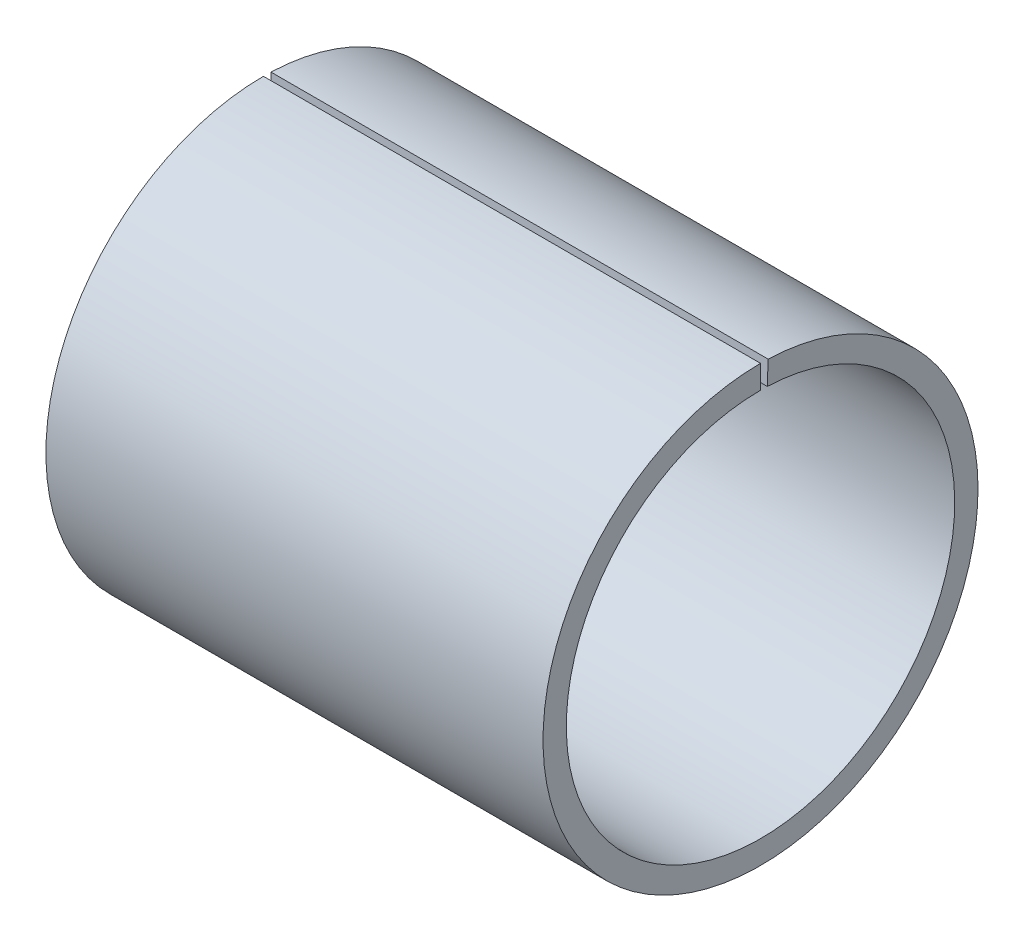
ISO-10303-21;
HEADER;
FILE_DESCRIPTION(('STEP AP214'),'2;1');
FILE_NAME('part.step','',(''),(''),'','','');
FILE_SCHEMA(('AUTOMOTIVE_DESIGN { 1 0 10303 214 1 1 1 1 }'));
ENDSEC;
DATA;
#1=APPLICATION_CONTEXT('core data for automotive mechanical design processes');
#2=APPLICATION_PROTOCOL_DEFINITION('international standard','automotive_design',2000,#1);
#3=PRODUCT_CONTEXT('',#1,'mechanical');
#4=PRODUCT('Part','Part','',(#3));
#5=PRODUCT_RELATED_PRODUCT_CATEGORY('part','',(#4));
#6=PRODUCT_DEFINITION_FORMATION('','',#4);
#7=PRODUCT_DEFINITION_CONTEXT('part definition',#1,'design');
#8=PRODUCT_DEFINITION('design','',#6,#7);
#9=PRODUCT_DEFINITION_SHAPE('','',#8);
#10=(LENGTH_UNIT() NAMED_UNIT(*) SI_UNIT(.MILLI.,.METRE.));
#11=(NAMED_UNIT(*) PLANE_ANGLE_UNIT() SI_UNIT($,.RADIAN.));
#12=(NAMED_UNIT(*) SI_UNIT($,.STERADIAN.) SOLID_ANGLE_UNIT());
#13=UNCERTAINTY_MEASURE_WITH_UNIT(LENGTH_MEASURE(1.E-05),#10,'distance_accuracy_value','');
#14=(GEOMETRIC_REPRESENTATION_CONTEXT(3) GLOBAL_UNCERTAINTY_ASSIGNED_CONTEXT((#13)) GLOBAL_UNIT_ASSIGNED_CONTEXT((#10,
#11,#12)) REPRESENTATION_CONTEXT('',''));
#15=CARTESIAN_POINT('',(0.,0.,0.));
#16=DIRECTION('',(0.,0.,1.));
#17=DIRECTION('',(1.,0.,0.));
#18=AXIS2_PLACEMENT_3D('',#15,#16,#17);
#19=CARTESIAN_POINT('',(0.,13.9914715782673,-0.488592953834825));
#20=DIRECTION('',(1.,0.,0.));
#21=DIRECTION('',(0.,0.,-1.));
#22=AXIS2_PLACEMENT_3D('',#19,#20,#21);
#23=PLANE('',#22);
#24=CARTESIAN_POINT('',(0.,0.,0.));
#25=DIRECTION('',(-1.,0.,0.));
#26=DIRECTION('',(0.,0.,1.));
#27=AXIS2_PLACEMENT_3D('',#24,#25,#26);
#28=CIRCLE('',#27,12.5);
#29=CARTESIAN_POINT('',(0.,12.4923853377387,-0.436243708781094));
#30=VERTEX_POINT('',#29);
#31=CARTESIAN_POINT('',(0.,12.5,0.));
#32=VERTEX_POINT('',#31);
#33=EDGE_CURVE('E11',#30,#32,#28,.T.);
#34=ORIENTED_EDGE('',*,*,#33,.F.);
#35=DIRECTION('',(0.,-0.999390827019096,0.0348994967024875));
#36=VECTOR('',#35,1.);
#37=CARTESIAN_POINT('',(0.,13.9914715782673,-0.488592953834825));
#38=LINE('',#37,#36);
#39=CARTESIAN_POINT('',(0.,13.9914715782673,-0.488592953834825));
#40=VERTEX_POINT('',#39);
#41=EDGE_CURVE('E95',#40,#30,#38,.T.);
#42=ORIENTED_EDGE('',*,*,#41,.F.);
#43=CARTESIAN_POINT('',(0.,0.,0.));
#44=DIRECTION('',(-1.,0.,0.));
#45=DIRECTION('',(0.,0.,1.));
#46=AXIS2_PLACEMENT_3D('',#43,#44,#45);
#47=CIRCLE('',#46,14.);
#48=CARTESIAN_POINT('',(0.,14.,0.));
#49=VERTEX_POINT('',#48);
#50=EDGE_CURVE('E48',#40,#49,#47,.T.);
#51=ORIENTED_EDGE('',*,*,#50,.T.);
#52=DIRECTION('',(0.,-1.,0.));
#53=VECTOR('',#52,1.);
#54=CARTESIAN_POINT('',(0.,14.,0.));
#55=LINE('',#54,#53);
#56=EDGE_CURVE('E84',#49,#32,#55,.T.);
#57=ORIENTED_EDGE('',*,*,#56,.T.);
#58=EDGE_LOOP('',(#34,#42,#51,#57));
#59=FACE_BOUND('',#58,.T.);
#60=ADVANCED_FACE('F33',(#59),#23,.F.);
#61=CARTESIAN_POINT('',(0.,0.,0.));
#62=DIRECTION('',(-1.,0.,0.));
#63=DIRECTION('',(0.,0.,1.));
#64=AXIS2_PLACEMENT_3D('',#61,#62,#63);
#65=CYLINDRICAL_SURFACE('',#64,12.5);
#66=CARTESIAN_POINT('',(32.,0.,0.));
#67=DIRECTION('',(-1.,0.,0.));
#68=DIRECTION('',(0.,0.,1.));
#69=AXIS2_PLACEMENT_3D('',#66,#67,#68);
#70=CIRCLE('',#69,12.5);
#71=CARTESIAN_POINT('',(32.,12.4923853377387,-0.436243708781094));
#72=VERTEX_POINT('',#71);
#73=CARTESIAN_POINT('',(32.,12.5,0.));
#74=VERTEX_POINT('',#73);
#75=EDGE_CURVE('E41',#72,#74,#70,.T.);
#76=ORIENTED_EDGE('',*,*,#75,.F.);
#77=DIRECTION('',(1.,0.,0.));
#78=VECTOR('',#77,1.);
#79=CARTESIAN_POINT('',(0.,12.4923853377387,-0.436243708781094));
#80=LINE('',#79,#78);
#81=EDGE_CURVE('E80',#30,#72,#80,.T.);
#82=ORIENTED_EDGE('',*,*,#81,.F.);
#83=ORIENTED_EDGE('',*,*,#33,.T.);
#84=DIRECTION('',(1.,0.,0.));
#85=VECTOR('',#84,1.);
#86=CARTESIAN_POINT('',(0.,12.5,0.));
#87=LINE('',#86,#85);
#88=EDGE_CURVE('E77',#32,#74,#87,.T.);
#89=ORIENTED_EDGE('',*,*,#88,.T.);
#90=EDGE_LOOP('',(#76,#82,#83,#89));
#91=FACE_BOUND('',#90,.T.);
#92=ADVANCED_FACE('F35',(#91),#65,.F.);
#93=CARTESIAN_POINT('',(32.,13.9914715782673,-0.488592953834825));
#94=DIRECTION('',(-1.,0.,0.));
#95=DIRECTION('',(0.,0.,1.));
#96=AXIS2_PLACEMENT_3D('',#93,#94,#95);
#97=PLANE('',#96);
#98=CARTESIAN_POINT('',(32.,0.,0.));
#99=DIRECTION('',(-1.,0.,0.));
#100=DIRECTION('',(0.,0.,1.));
#101=AXIS2_PLACEMENT_3D('',#98,#99,#100);
#102=CIRCLE('',#101,14.);
#103=CARTESIAN_POINT('',(32.,13.9914715782673,-0.488592953834825));
#104=VERTEX_POINT('',#103);
#105=CARTESIAN_POINT('',(32.,14.,0.));
#106=VERTEX_POINT('',#105);
#107=EDGE_CURVE('E56',#104,#106,#102,.T.);
#108=ORIENTED_EDGE('',*,*,#107,.F.);
#109=DIRECTION('',(0.,0.999390827019096,-0.0348994967024875));
#110=VECTOR('',#109,1.);
#111=CARTESIAN_POINT('',(32.,13.9914715782673,-0.488592953834825));
#112=LINE('',#111,#110);
#113=EDGE_CURVE('E98',#72,#104,#112,.T.);
#114=ORIENTED_EDGE('',*,*,#113,.F.);
#115=ORIENTED_EDGE('',*,*,#75,.T.);
#116=DIRECTION('',(0.,1.,0.));
#117=VECTOR('',#116,1.);
#118=CARTESIAN_POINT('',(32.,14.,0.));
#119=LINE('',#118,#117);
#120=EDGE_CURVE('E89',#74,#106,#119,.T.);
#121=ORIENTED_EDGE('',*,*,#120,.T.);
#122=EDGE_LOOP('',(#108,#114,#115,#121));
#123=FACE_BOUND('',#122,.T.);
#124=ADVANCED_FACE('F104',(#123),#97,.F.);
#125=CARTESIAN_POINT('',(0.,0.,0.));
#126=DIRECTION('',(-1.,0.,0.));
#127=DIRECTION('',(0.,0.,1.));
#128=AXIS2_PLACEMENT_3D('',#125,#126,#127);
#129=CYLINDRICAL_SURFACE('',#128,14.);
#130=DIRECTION('',(-1.,0.,0.));
#131=VECTOR('',#130,1.);
#132=CARTESIAN_POINT('',(0.,13.9914715782673,-0.488592953834825));
#133=LINE('',#132,#131);
#134=EDGE_CURVE('E100',#104,#40,#133,.T.);
#135=ORIENTED_EDGE('',*,*,#134,.F.);
#136=ORIENTED_EDGE('',*,*,#107,.T.);
#137=DIRECTION('',(-1.,0.,0.));
#138=VECTOR('',#137,1.);
#139=CARTESIAN_POINT('',(0.,14.,0.));
#140=LINE('',#139,#138);
#141=EDGE_CURVE('E91',#106,#49,#140,.T.);
#142=ORIENTED_EDGE('',*,*,#141,.T.);
#143=ORIENTED_EDGE('',*,*,#50,.F.);
#144=EDGE_LOOP('',(#135,#136,#142,#143));
#145=FACE_BOUND('',#144,.T.);
#146=ADVANCED_FACE('F107',(#145),#129,.T.);
#147=CARTESIAN_POINT('',(0.,12.4923853377387,-0.436243708781094));
#148=DIRECTION('',(0.,0.0348994967024875,0.999390827019096));
#149=DIRECTION('',(1.,0.,0.));
#150=AXIS2_PLACEMENT_3D('',#147,#148,#149);
#151=PLANE('',#150);
#152=ORIENTED_EDGE('',*,*,#41,.T.);
#153=ORIENTED_EDGE('',*,*,#81,.T.);
#154=ORIENTED_EDGE('',*,*,#113,.T.);
#155=ORIENTED_EDGE('',*,*,#134,.T.);
#156=EDGE_LOOP('',(#152,#153,#154,#155));
#157=FACE_BOUND('',#156,.T.);
#158=ADVANCED_FACE('F106',(#157),#151,.T.);
#159=CARTESIAN_POINT('',(0.,12.5,0.));
#160=DIRECTION('',(0.,0.,1.));
#161=DIRECTION('',(1.,0.,0.));
#162=AXIS2_PLACEMENT_3D('',#159,#160,#161);
#163=PLANE('',#162);
#164=ORIENTED_EDGE('',*,*,#56,.F.);
#165=ORIENTED_EDGE('',*,*,#141,.F.);
#166=ORIENTED_EDGE('',*,*,#120,.F.);
#167=ORIENTED_EDGE('',*,*,#88,.F.);
#168=EDGE_LOOP('',(#164,#165,#166,#167));
#169=FACE_BOUND('',#168,.T.);
#170=ADVANCED_FACE('F88',(#169),#163,.F.);
#171=CLOSED_SHELL('',(#60,#92,#124,#146,#158,#170));
#172=MANIFOLD_SOLID_BREP('B2',#171);
#173=ADVANCED_BREP_SHAPE_REPRESENTATION('',(#18,#172),#14);
#174=SHAPE_DEFINITION_REPRESENTATION(#9,#173);
ENDSEC;
END-ISO-10303-21;
